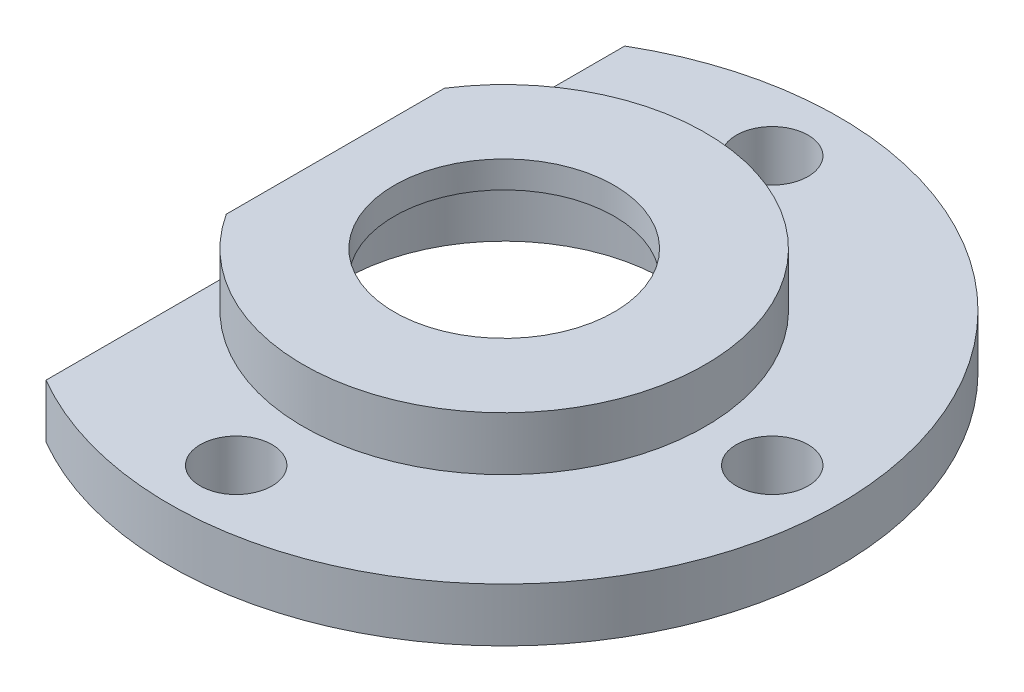
ISO-10303-21;
HEADER;
FILE_DESCRIPTION(('STEP AP214'),'2;1');
FILE_NAME('part.step','',(''),(''),'','','');
FILE_SCHEMA(('AUTOMOTIVE_DESIGN { 1 0 10303 214 1 1 1 1 }'));
ENDSEC;
DATA;
#1=APPLICATION_CONTEXT('core data for automotive mechanical design processes');
#2=APPLICATION_PROTOCOL_DEFINITION('international standard','automotive_design',2000,#1);
#3=PRODUCT_CONTEXT('',#1,'mechanical');
#4=PRODUCT('Part','Part','',(#3));
#5=PRODUCT_RELATED_PRODUCT_CATEGORY('part','',(#4));
#6=PRODUCT_DEFINITION_FORMATION('','',#4);
#7=PRODUCT_DEFINITION_CONTEXT('part definition',#1,'design');
#8=PRODUCT_DEFINITION('design','',#6,#7);
#9=PRODUCT_DEFINITION_SHAPE('','',#8);
#10=(LENGTH_UNIT() NAMED_UNIT(*) SI_UNIT(.MILLI.,.METRE.));
#11=(NAMED_UNIT(*) PLANE_ANGLE_UNIT() SI_UNIT($,.RADIAN.));
#12=(NAMED_UNIT(*) SI_UNIT($,.STERADIAN.) SOLID_ANGLE_UNIT());
#13=UNCERTAINTY_MEASURE_WITH_UNIT(LENGTH_MEASURE(1.E-05),#10,'distance_accuracy_value','');
#14=(GEOMETRIC_REPRESENTATION_CONTEXT(3) GLOBAL_UNCERTAINTY_ASSIGNED_CONTEXT((#13)) GLOBAL_UNIT_ASSIGNED_CONTEXT((#10,
#11,#12)) REPRESENTATION_CONTEXT('',''));
#15=CARTESIAN_POINT('',(0.,0.,0.));
#16=DIRECTION('',(0.,0.,1.));
#17=DIRECTION('',(1.,0.,0.));
#18=AXIS2_PLACEMENT_3D('',#15,#16,#17);
#19=CARTESIAN_POINT('',(0.,2.54,0.));
#20=DIRECTION('',(0.,-1.,0.));
#21=DIRECTION('',(0.,0.,1.));
#22=AXIS2_PLACEMENT_3D('',#19,#20,#21);
#23=CYLINDRICAL_SURFACE('',#22,15.875);
#24=DIRECTION('',(0.,-1.,0.));
#25=VECTOR('',#24,1.);
#26=CARTESIAN_POINT('',(-8.,5.33400000000001,13.7118789740867));
#27=LINE('',#26,#25);
#28=CARTESIAN_POINT('',(-8.,2.54,13.7118789740867));
#29=VERTEX_POINT('',#28);
#30=CARTESIAN_POINT('',(-8.,0.,13.7118789740867));
#31=VERTEX_POINT('',#30);
#32=EDGE_CURVE('E78',#29,#31,#27,.T.);
#33=ORIENTED_EDGE('',*,*,#32,.T.);
#34=CARTESIAN_POINT('',(0.,0.,0.));
#35=DIRECTION('',(0.,-1.,0.));
#36=DIRECTION('',(0.,0.,-1.));
#37=AXIS2_PLACEMENT_3D('',#34,#35,#36);
#38=CIRCLE('',#37,15.875);
#39=CARTESIAN_POINT('',(-8.,0.,-13.7118789740867));
#40=VERTEX_POINT('',#39);
#41=EDGE_CURVE('E84',#40,#31,#38,.T.);
#42=ORIENTED_EDGE('',*,*,#41,.F.);
#43=DIRECTION('',(0.,-1.,0.));
#44=VECTOR('',#43,1.);
#45=CARTESIAN_POINT('',(-8.,5.33400000000001,-13.7118789740867));
#46=LINE('',#45,#44);
#47=CARTESIAN_POINT('',(-8.,2.54,-13.7118789740867));
#48=VERTEX_POINT('',#47);
#49=EDGE_CURVE('E80',#48,#40,#46,.T.);
#50=ORIENTED_EDGE('',*,*,#49,.F.);
#51=CARTESIAN_POINT('',(0.,2.54,0.));
#52=DIRECTION('',(0.,-1.,0.));
#53=DIRECTION('',(0.,0.,-1.));
#54=AXIS2_PLACEMENT_3D('',#51,#52,#53);
#55=CIRCLE('',#54,15.875);
#56=EDGE_CURVE('E87',#48,#29,#55,.T.);
#57=ORIENTED_EDGE('',*,*,#56,.T.);
#58=EDGE_LOOP('',(#33,#42,#50,#57));
#59=FACE_BOUND('',#58,.T.);
#60=ADVANCED_FACE('F36',(#59),#23,.T.);
#61=CARTESIAN_POINT('',(0.,2.54,0.));
#62=DIRECTION('',(0.,1.,0.));
#63=DIRECTION('',(0.,0.,-1.));
#64=AXIS2_PLACEMENT_3D('',#61,#62,#63);
#65=PLANE('',#64);
#66=CARTESIAN_POINT('',(0.,2.54,-12.7));
#67=DIRECTION('',(0.,-1.,0.));
#68=DIRECTION('',(0.,0.,-1.));
#69=AXIS2_PLACEMENT_3D('',#66,#67,#68);
#70=CIRCLE('',#69,1.7);
#71=CARTESIAN_POINT('',(0.,2.54,-14.4));
#72=VERTEX_POINT('',#71);
#73=EDGE_CURVE('E112',#72,#72,#70,.T.);
#74=ORIENTED_EDGE('',*,*,#73,.T.);
#75=EDGE_LOOP('',(#74));
#76=FACE_BOUND('',#75,.T.);
#77=CARTESIAN_POINT('',(12.7,2.54,0.));
#78=DIRECTION('',(0.,-1.,0.));
#79=DIRECTION('',(0.,0.,-1.));
#80=AXIS2_PLACEMENT_3D('',#77,#78,#79);
#81=CIRCLE('',#80,1.70000000000004);
#82=CARTESIAN_POINT('',(12.7,2.54,-1.70000000000004));
#83=VERTEX_POINT('',#82);
#84=EDGE_CURVE('E105',#83,#83,#81,.T.);
#85=ORIENTED_EDGE('',*,*,#84,.T.);
#86=EDGE_LOOP('',(#85));
#87=FACE_BOUND('',#86,.T.);
#88=CARTESIAN_POINT('',(0.,2.54,12.7));
#89=DIRECTION('',(0.,-1.,0.));
#90=DIRECTION('',(0.,0.,-1.));
#91=AXIS2_PLACEMENT_3D('',#88,#89,#90);
#92=CIRCLE('',#91,1.7);
#93=CARTESIAN_POINT('',(0.,2.54,11.));
#94=VERTEX_POINT('',#93);
#95=EDGE_CURVE('E101',#94,#94,#92,.T.);
#96=ORIENTED_EDGE('',*,*,#95,.T.);
#97=EDGE_LOOP('',(#96));
#98=FACE_BOUND('',#97,.T.);
#99=ORIENTED_EDGE('',*,*,#56,.F.);
#100=DIRECTION('',(0.,0.,-1.));
#101=VECTOR('',#100,1.);
#102=CARTESIAN_POINT('',(-8.,2.54,0.));
#103=LINE('',#102,#101);
#104=CARTESIAN_POINT('',(-8.,2.54,-5.16968325915621));
#105=VERTEX_POINT('',#104);
#106=EDGE_CURVE('E98',#105,#48,#103,.T.);
#107=ORIENTED_EDGE('',*,*,#106,.F.);
#108=CARTESIAN_POINT('',(0.,2.54,0.));
#109=DIRECTION('',(0.,-1.,0.));
#110=DIRECTION('',(0.,0.,-1.));
#111=AXIS2_PLACEMENT_3D('',#108,#109,#110);
#112=CIRCLE('',#111,9.525);
#113=CARTESIAN_POINT('',(-8.,2.54,5.16968325915621));
#114=VERTEX_POINT('',#113);
#115=EDGE_CURVE('E43',#105,#114,#112,.T.);
#116=ORIENTED_EDGE('',*,*,#115,.T.);
#117=EDGE_CURVE('E100',#29,#114,#103,.T.);
#118=ORIENTED_EDGE('',*,*,#117,.F.);
#119=EDGE_LOOP('',(#99,#107,#116,#118));
#120=FACE_BOUND('',#119,.T.);
#121=ADVANCED_FACE('F136',(#76,#87,#98,#120),#65,.T.);
#122=CARTESIAN_POINT('',(0.,0.,0.));
#123=DIRECTION('',(0.,1.,0.));
#124=DIRECTION('',(0.,0.,-1.));
#125=AXIS2_PLACEMENT_3D('',#122,#123,#124);
#126=PLANE('',#125);
#127=CARTESIAN_POINT('',(0.,0.,0.));
#128=DIRECTION('',(0.,1.,0.));
#129=DIRECTION('',(0.,0.,1.));
#130=AXIS2_PLACEMENT_3D('',#127,#128,#129);
#131=CIRCLE('',#130,7.62);
#132=CARTESIAN_POINT('',(0.,0.,7.62));
#133=VERTEX_POINT('',#132);
#134=EDGE_CURVE('E123',#133,#133,#131,.T.);
#135=ORIENTED_EDGE('',*,*,#134,.T.);
#136=EDGE_LOOP('',(#135));
#137=FACE_BOUND('',#136,.T.);
#138=CARTESIAN_POINT('',(0.,0.,-12.7));
#139=DIRECTION('',(0.,-1.,0.));
#140=DIRECTION('',(0.,0.,-1.));
#141=AXIS2_PLACEMENT_3D('',#138,#139,#140);
#142=CIRCLE('',#141,1.7);
#143=CARTESIAN_POINT('',(0.,0.,-14.4));
#144=VERTEX_POINT('',#143);
#145=EDGE_CURVE('E115',#144,#144,#142,.F.);
#146=ORIENTED_EDGE('',*,*,#145,.T.);
#147=EDGE_LOOP('',(#146));
#148=FACE_BOUND('',#147,.T.);
#149=CARTESIAN_POINT('',(12.7,0.,0.));
#150=DIRECTION('',(0.,-1.,0.));
#151=DIRECTION('',(0.,0.,-1.));
#152=AXIS2_PLACEMENT_3D('',#149,#150,#151);
#153=CIRCLE('',#152,1.70000000000004);
#154=CARTESIAN_POINT('',(12.7,0.,-1.70000000000004));
#155=VERTEX_POINT('',#154);
#156=EDGE_CURVE('E109',#155,#155,#153,.F.);
#157=ORIENTED_EDGE('',*,*,#156,.T.);
#158=EDGE_LOOP('',(#157));
#159=FACE_BOUND('',#158,.T.);
#160=CARTESIAN_POINT('',(0.,0.,12.7));
#161=DIRECTION('',(0.,-1.,0.));
#162=DIRECTION('',(0.,0.,-1.));
#163=AXIS2_PLACEMENT_3D('',#160,#161,#162);
#164=CIRCLE('',#163,1.7);
#165=CARTESIAN_POINT('',(0.,0.,11.));
#166=VERTEX_POINT('',#165);
#167=EDGE_CURVE('E104',#166,#166,#164,.F.);
#168=ORIENTED_EDGE('',*,*,#167,.T.);
#169=EDGE_LOOP('',(#168));
#170=FACE_BOUND('',#169,.T.);
#171=DIRECTION('',(0.,0.,-1.));
#172=VECTOR('',#171,1.);
#173=CARTESIAN_POINT('',(-8.,0.,0.));
#174=LINE('',#173,#172);
#175=EDGE_CURVE('E74',#31,#40,#174,.T.);
#176=ORIENTED_EDGE('',*,*,#175,.T.);
#177=ORIENTED_EDGE('',*,*,#41,.T.);
#178=EDGE_LOOP('',(#176,#177));
#179=FACE_BOUND('',#178,.T.);
#180=ADVANCED_FACE('F85',(#137,#148,#159,#170,#179),#126,.F.);
#181=CARTESIAN_POINT('',(0.,5.08,0.));
#182=DIRECTION('',(0.,-1.,0.));
#183=DIRECTION('',(0.,0.,1.));
#184=AXIS2_PLACEMENT_3D('',#181,#182,#183);
#185=CYLINDRICAL_SURFACE('',#184,9.525);
#186=DIRECTION('',(0.,-1.,0.));
#187=VECTOR('',#186,1.);
#188=CARTESIAN_POINT('',(-8.,5.08,5.16968325915621));
#189=LINE('',#188,#187);
#190=CARTESIAN_POINT('',(-8.,5.08,5.16968325915621));
#191=VERTEX_POINT('',#190);
#192=EDGE_CURVE('E55',#191,#114,#189,.T.);
#193=ORIENTED_EDGE('',*,*,#192,.T.);
#194=ORIENTED_EDGE('',*,*,#115,.F.);
#195=DIRECTION('',(0.,-1.,0.));
#196=VECTOR('',#195,1.);
#197=CARTESIAN_POINT('',(-8.,5.08,-5.16968325915621));
#198=LINE('',#197,#196);
#199=CARTESIAN_POINT('',(-8.,5.08,-5.16968325915621));
#200=VERTEX_POINT('',#199);
#201=EDGE_CURVE('E91',#105,#200,#198,.F.);
#202=ORIENTED_EDGE('',*,*,#201,.T.);
#203=CARTESIAN_POINT('',(0.,5.08,0.));
#204=DIRECTION('',(0.,-1.,0.));
#205=DIRECTION('',(0.,0.,-1.));
#206=AXIS2_PLACEMENT_3D('',#203,#204,#205);
#207=CIRCLE('',#206,9.525);
#208=EDGE_CURVE('E88',#200,#191,#207,.T.);
#209=ORIENTED_EDGE('',*,*,#208,.T.);
#210=EDGE_LOOP('',(#193,#194,#202,#209));
#211=FACE_BOUND('',#210,.T.);
#212=ADVANCED_FACE('F137',(#211),#185,.T.);
#213=CARTESIAN_POINT('',(0.,5.08,0.));
#214=DIRECTION('',(0.,1.,0.));
#215=DIRECTION('',(0.,0.,-1.));
#216=AXIS2_PLACEMENT_3D('',#213,#214,#215);
#217=PLANE('',#216);
#218=CARTESIAN_POINT('',(0.,5.08,0.));
#219=DIRECTION('',(0.,-1.,0.));
#220=DIRECTION('',(0.,0.,-1.));
#221=AXIS2_PLACEMENT_3D('',#218,#219,#220);
#222=CIRCLE('',#221,5.207);
#223=CARTESIAN_POINT('',(0.,5.08,-5.207));
#224=VERTEX_POINT('',#223);
#225=EDGE_CURVE('E120',#224,#224,#222,.T.);
#226=ORIENTED_EDGE('',*,*,#225,.T.);
#227=EDGE_LOOP('',(#226));
#228=FACE_BOUND('',#227,.T.);
#229=ORIENTED_EDGE('',*,*,#208,.F.);
#230=DIRECTION('',(0.,0.,-1.));
#231=VECTOR('',#230,1.);
#232=CARTESIAN_POINT('',(-8.,5.08,0.));
#233=LINE('',#232,#231);
#234=EDGE_CURVE('E11',#191,#200,#233,.T.);
#235=ORIENTED_EDGE('',*,*,#234,.F.);
#236=EDGE_LOOP('',(#229,#235));
#237=FACE_BOUND('',#236,.T.);
#238=ADVANCED_FACE('F139',(#228,#237),#217,.T.);
#239=CARTESIAN_POINT('',(0.,3.81,0.));
#240=DIRECTION('',(0.,-1.,0.));
#241=DIRECTION('',(0.,0.,1.));
#242=AXIS2_PLACEMENT_3D('',#239,#240,#241);
#243=CYLINDRICAL_SURFACE('',#242,7.62);
#244=CARTESIAN_POINT('',(0.,3.81,0.));
#245=DIRECTION('',(0.,1.,0.));
#246=DIRECTION('',(0.,0.,1.));
#247=AXIS2_PLACEMENT_3D('',#244,#245,#246);
#248=CIRCLE('',#247,7.62);
#249=CARTESIAN_POINT('',(0.,3.81,7.62));
#250=VERTEX_POINT('',#249);
#251=EDGE_CURVE('E126',#250,#250,#248,.T.);
#252=CARTESIAN_POINT('',(0.,3.81,7.62));
#253=CARTESIAN_POINT('',(0.,3.7703125,7.62));
#254=CARTESIAN_POINT('',(0.,3.730625,7.62));
#255=CARTESIAN_POINT('',(0.,3.65125,7.62));
#256=CARTESIAN_POINT('',(0.,3.6115625,7.62));
#257=CARTESIAN_POINT('',(0.,3.5321875,7.62));
#258=CARTESIAN_POINT('',(0.,3.4925,7.62));
#259=CARTESIAN_POINT('',(0.,3.413125,7.62));
#260=CARTESIAN_POINT('',(0.,3.3734375,7.62));
#261=CARTESIAN_POINT('',(0.,3.2940625,7.62));
#262=CARTESIAN_POINT('',(0.,3.254375,7.62));
#263=CARTESIAN_POINT('',(0.,3.175,7.62));
#264=CARTESIAN_POINT('',(0.,3.1353125,7.62));
#265=CARTESIAN_POINT('',(0.,3.0559375,7.62));
#266=CARTESIAN_POINT('',(0.,3.01625,7.62));
#267=CARTESIAN_POINT('',(0.,2.936875,7.62));
#268=CARTESIAN_POINT('',(0.,2.8971875,7.62));
#269=CARTESIAN_POINT('',(0.,2.8178125,7.62));
#270=CARTESIAN_POINT('',(0.,2.778125,7.62));
#271=CARTESIAN_POINT('',(0.,2.69875,7.62));
#272=CARTESIAN_POINT('',(0.,2.6590625,7.62));
#273=CARTESIAN_POINT('',(0.,2.5796875,7.62));
#274=CARTESIAN_POINT('',(0.,2.54,7.62));
#275=CARTESIAN_POINT('',(0.,2.460625,7.62));
#276=CARTESIAN_POINT('',(0.,2.4209375,7.62));
#277=CARTESIAN_POINT('',(0.,2.3415625,7.62));
#278=CARTESIAN_POINT('',(0.,2.301875,7.62));
#279=CARTESIAN_POINT('',(0.,2.2225,7.62));
#280=CARTESIAN_POINT('',(0.,2.1828125,7.62));
#281=CARTESIAN_POINT('',(0.,2.1034375,7.62));
#282=CARTESIAN_POINT('',(0.,2.06375,7.62));
#283=CARTESIAN_POINT('',(0.,1.984375,7.62));
#284=CARTESIAN_POINT('',(0.,1.9446875,7.62));
#285=CARTESIAN_POINT('',(0.,1.8653125,7.62));
#286=CARTESIAN_POINT('',(0.,1.825625,7.62));
#287=CARTESIAN_POINT('',(0.,1.74625,7.62));
#288=CARTESIAN_POINT('',(0.,1.7065625,7.62));
#289=CARTESIAN_POINT('',(0.,1.6271875,7.62));
#290=CARTESIAN_POINT('',(0.,1.5875,7.62));
#291=CARTESIAN_POINT('',(0.,1.508125,7.62));
#292=CARTESIAN_POINT('',(0.,1.4684375,7.62));
#293=CARTESIAN_POINT('',(0.,1.3890625,7.62));
#294=CARTESIAN_POINT('',(0.,1.349375,7.62));
#295=CARTESIAN_POINT('',(0.,1.27,7.62));
#296=CARTESIAN_POINT('',(0.,1.2303125,7.62));
#297=CARTESIAN_POINT('',(0.,1.1509375,7.62));
#298=CARTESIAN_POINT('',(0.,1.11125,7.62));
#299=CARTESIAN_POINT('',(0.,1.031875,7.62));
#300=CARTESIAN_POINT('',(0.,0.9921875,7.62));
#301=CARTESIAN_POINT('',(0.,0.9128125,7.62));
#302=CARTESIAN_POINT('',(0.,0.873125,7.62));
#303=CARTESIAN_POINT('',(0.,0.79375,7.62));
#304=CARTESIAN_POINT('',(0.,0.7540625,7.62));
#305=CARTESIAN_POINT('',(0.,0.6746875,7.62));
#306=CARTESIAN_POINT('',(0.,0.635,7.62));
#307=CARTESIAN_POINT('',(0.,0.555625,7.62));
#308=CARTESIAN_POINT('',(0.,0.5159375,7.62));
#309=CARTESIAN_POINT('',(0.,0.4365625,7.62));
#310=CARTESIAN_POINT('',(0.,0.396875,7.62));
#311=CARTESIAN_POINT('',(0.,0.3175,7.62));
#312=CARTESIAN_POINT('',(0.,0.2778125,7.62));
#313=CARTESIAN_POINT('',(0.,0.1984375,7.62));
#314=CARTESIAN_POINT('',(0.,0.15875,7.62));
#315=CARTESIAN_POINT('',(0.,0.0793749999999999,7.62));
#316=CARTESIAN_POINT('',(0.,0.0396874999999999,7.62));
#317=CARTESIAN_POINT('',(0.,0.,7.62));
#318=B_SPLINE_CURVE_WITH_KNOTS('',3,(#252,#253,#254,#255,#256,#257,#258,#259,#260,#261,#262,
#263,#264,#265,#266,#267,#268,#269,#270,#271,#272,#273,#274,#275,#276,#277,#278,#279,#280,#281,
#282,#283,#284,#285,#286,#287,#288,#289,#290,#291,#292,#293,#294,#295,#296,#297,#298,#299,#300,
#301,#302,#303,#304,#305,#306,#307,#308,#309,#310,#311,#312,#313,#314,#315,#316,#317),
.UNSPECIFIED.,.F.,.F.,(4,2,2,2,2,2,2,2,2,2,2,2,2,2,2,2,2,2,2,2,2,2,2,2,2,2,2,2,2,2,2,2,4),(0.,
0.1190625,0.238125,0.3571875,0.47625,0.5953125,0.714375,0.8334375,0.9525,1.0715625,1.190625,
1.3096875,1.42875,1.5478125,1.666875,1.7859375,1.905,2.0240625,2.143125,2.2621875,2.38125,
2.5003125,2.619375,2.7384375,2.8575,2.9765625,3.095625,3.2146875,3.33375,3.4528125,3.571875,
3.6909375,3.81),.UNSPECIFIED.);
#319=EDGE_CURVE('BSEAM141',#250,#133,#318,.T.);
#320=ORIENTED_EDGE('',*,*,#251,.T.);
#321=ORIENTED_EDGE('',*,*,#134,.F.);
#322=ORIENTED_EDGE('',*,*,#319,.T.);
#323=ORIENTED_EDGE('',*,*,#319,.F.);
#324=EDGE_LOOP('',(#320,#322,#321,#323));
#325=FACE_BOUND('',#324,.T.);
#326=ADVANCED_FACE('F141',(#325),#243,.F.);
#327=CARTESIAN_POINT('',(0.,3.81,0.));
#328=DIRECTION('',(0.,-1.,0.));
#329=DIRECTION('',(0.,0.,1.));
#330=AXIS2_PLACEMENT_3D('',#327,#328,#329);
#331=PLANE('',#330);
#332=CARTESIAN_POINT('',(0.,3.81,0.));
#333=DIRECTION('',(0.,1.,0.));
#334=DIRECTION('',(0.,0.,1.));
#335=AXIS2_PLACEMENT_3D('',#332,#333,#334);
#336=CIRCLE('',#335,5.207);
#337=CARTESIAN_POINT('',(0.,3.81,5.207));
#338=VERTEX_POINT('',#337);
#339=EDGE_CURVE('E108',#338,#338,#336,.F.);
#340=ORIENTED_EDGE('',*,*,#339,.F.);
#341=EDGE_LOOP('',(#340));
#342=FACE_BOUND('',#341,.T.);
#343=ORIENTED_EDGE('',*,*,#251,.F.);
#344=EDGE_LOOP('',(#343));
#345=FACE_BOUND('',#344,.T.);
#346=ADVANCED_FACE('F148',(#342,#345),#331,.T.);
#347=CARTESIAN_POINT('',(0.,-0.00100000000000013,0.));
#348=DIRECTION('',(0.,1.,0.));
#349=DIRECTION('',(0.,0.,-1.));
#350=AXIS2_PLACEMENT_3D('',#347,#348,#349);
#351=CYLINDRICAL_SURFACE('',#350,5.207);
#352=ORIENTED_EDGE('',*,*,#339,.T.);
#353=EDGE_LOOP('',(#352));
#354=FACE_BOUND('',#353,.T.);
#355=ORIENTED_EDGE('',*,*,#225,.F.);
#356=EDGE_LOOP('',(#355));
#357=FACE_BOUND('',#356,.T.);
#358=ADVANCED_FACE('F186',(#354,#357),#351,.F.);
#359=CARTESIAN_POINT('',(0.,-0.00100000000000013,-12.7));
#360=DIRECTION('',(0.,1.,0.));
#361=DIRECTION('',(0.,0.,-1.));
#362=AXIS2_PLACEMENT_3D('',#359,#360,#361);
#363=CYLINDRICAL_SURFACE('',#362,1.7);
#364=ORIENTED_EDGE('',*,*,#73,.F.);
#365=EDGE_LOOP('',(#364));
#366=FACE_BOUND('',#365,.T.);
#367=ORIENTED_EDGE('',*,*,#145,.F.);
#368=EDGE_LOOP('',(#367));
#369=FACE_BOUND('',#368,.T.);
#370=ADVANCED_FACE('F180',(#366,#369),#363,.F.);
#371=CARTESIAN_POINT('',(12.7,-0.00100000000000013,0.));
#372=DIRECTION('',(0.,1.,0.));
#373=DIRECTION('',(0.,0.,-1.));
#374=AXIS2_PLACEMENT_3D('',#371,#372,#373);
#375=CYLINDRICAL_SURFACE('',#374,1.70000000000004);
#376=ORIENTED_EDGE('',*,*,#84,.F.);
#377=EDGE_LOOP('',(#376));
#378=FACE_BOUND('',#377,.T.);
#379=ORIENTED_EDGE('',*,*,#156,.F.);
#380=EDGE_LOOP('',(#379));
#381=FACE_BOUND('',#380,.T.);
#382=ADVANCED_FACE('F171',(#378,#381),#375,.F.);
#383=CARTESIAN_POINT('',(0.,-0.00100000000000013,12.7));
#384=DIRECTION('',(0.,1.,0.));
#385=DIRECTION('',(0.,0.,-1.));
#386=AXIS2_PLACEMENT_3D('',#383,#384,#385);
#387=CYLINDRICAL_SURFACE('',#386,1.7);
#388=ORIENTED_EDGE('',*,*,#95,.F.);
#389=EDGE_LOOP('',(#388));
#390=FACE_BOUND('',#389,.T.);
#391=ORIENTED_EDGE('',*,*,#167,.F.);
#392=EDGE_LOOP('',(#391));
#393=FACE_BOUND('',#392,.T.);
#394=ADVANCED_FACE('F168',(#390,#393),#387,.F.);
#395=CARTESIAN_POINT('',(-8.,5.33400000000001,0.));
#396=DIRECTION('',(-1.,0.,0.));
#397=DIRECTION('',(0.,0.,-1.));
#398=AXIS2_PLACEMENT_3D('',#395,#396,#397);
#399=PLANE('',#398);
#400=ORIENTED_EDGE('',*,*,#32,.F.);
#401=ORIENTED_EDGE('',*,*,#117,.T.);
#402=ORIENTED_EDGE('',*,*,#192,.F.);
#403=ORIENTED_EDGE('',*,*,#234,.T.);
#404=ORIENTED_EDGE('',*,*,#201,.F.);
#405=ORIENTED_EDGE('',*,*,#106,.T.);
#406=ORIENTED_EDGE('',*,*,#49,.T.);
#407=ORIENTED_EDGE('',*,*,#175,.F.);
#408=EDGE_LOOP('',(#400,#401,#402,#403,#404,#405,#406,#407));
#409=FACE_BOUND('',#408,.T.);
#410=ADVANCED_FACE('F76',(#409),#399,.T.);
#411=CLOSED_SHELL('',(#60,#121,#180,#212,#238,#326,#346,#358,#370,#382,#394,#410));
#412=MANIFOLD_SOLID_BREP('B2',#411);
#413=ADVANCED_BREP_SHAPE_REPRESENTATION('',(#18,#412),#14);
#414=SHAPE_DEFINITION_REPRESENTATION(#9,#413);
ENDSEC;
END-ISO-10303-21;
